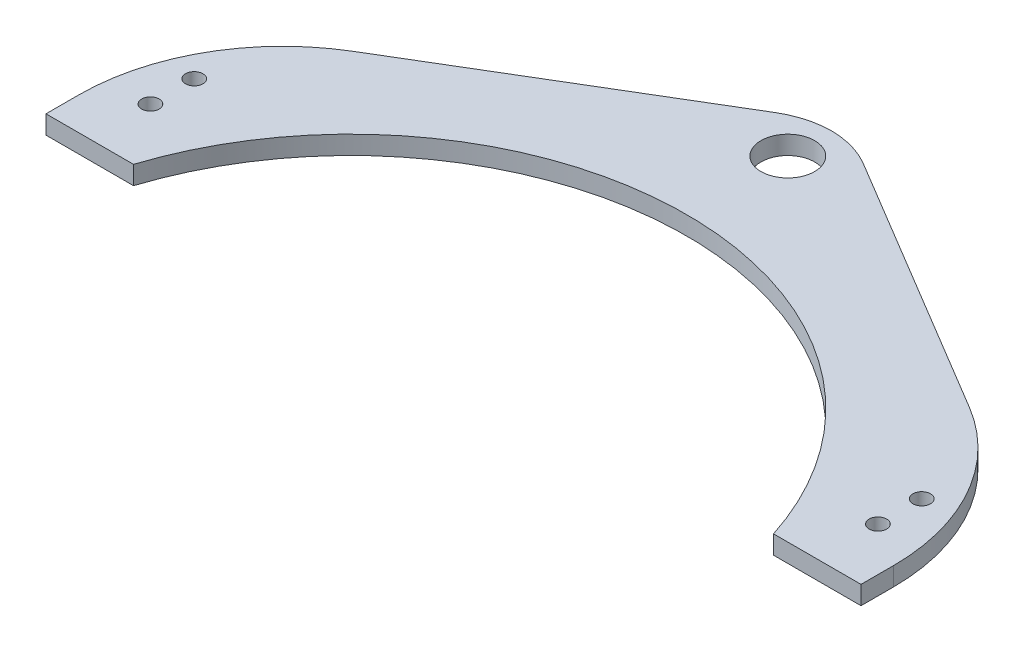
ISO-10303-21;
HEADER;
FILE_DESCRIPTION(('STEP AP214'),'2;1');
FILE_NAME('part.step','',(''),(''),'','','');
FILE_SCHEMA(('AUTOMOTIVE_DESIGN { 1 0 10303 214 1 1 1 1 }'));
ENDSEC;
DATA;
#1=APPLICATION_CONTEXT('core data for automotive mechanical design processes');
#2=APPLICATION_PROTOCOL_DEFINITION('international standard','automotive_design',2000,#1);
#3=PRODUCT_CONTEXT('',#1,'mechanical');
#4=PRODUCT('Part','Part','',(#3));
#5=PRODUCT_RELATED_PRODUCT_CATEGORY('part','',(#4));
#6=PRODUCT_DEFINITION_FORMATION('','',#4);
#7=PRODUCT_DEFINITION_CONTEXT('part definition',#1,'design');
#8=PRODUCT_DEFINITION('design','',#6,#7);
#9=PRODUCT_DEFINITION_SHAPE('','',#8);
#10=(LENGTH_UNIT() NAMED_UNIT(*) SI_UNIT(.MILLI.,.METRE.));
#11=(NAMED_UNIT(*) PLANE_ANGLE_UNIT() SI_UNIT($,.RADIAN.));
#12=(NAMED_UNIT(*) SI_UNIT($,.STERADIAN.) SOLID_ANGLE_UNIT());
#13=UNCERTAINTY_MEASURE_WITH_UNIT(LENGTH_MEASURE(1.E-05),#10,'distance_accuracy_value','');
#14=(GEOMETRIC_REPRESENTATION_CONTEXT(3) GLOBAL_UNCERTAINTY_ASSIGNED_CONTEXT((#13)) GLOBAL_UNIT_ASSIGNED_CONTEXT((#10,
#11,#12)) REPRESENTATION_CONTEXT('',''));
#15=CARTESIAN_POINT('',(0.,0.,0.));
#16=DIRECTION('',(0.,0.,1.));
#17=DIRECTION('',(1.,0.,0.));
#18=AXIS2_PLACEMENT_3D('',#15,#16,#17);
#19=CARTESIAN_POINT('',(0.,3.175,0.));
#20=DIRECTION('',(0.,0.,1.));
#21=DIRECTION('',(1.,0.,0.));
#22=AXIS2_PLACEMENT_3D('',#19,#20,#21);
#23=PLANE('',#22);
#24=DIRECTION('',(-1.,0.,0.));
#25=VECTOR('',#24,1.);
#26=CARTESIAN_POINT('',(0.,0.,0.));
#27=LINE('',#26,#25);
#28=CARTESIAN_POINT('',(0.,0.,0.));
#29=VERTEX_POINT('',#28);
#30=CARTESIAN_POINT('',(-15.,0.,0.));
#31=VERTEX_POINT('',#30);
#32=EDGE_CURVE('E180',#29,#31,#27,.T.);
#33=ORIENTED_EDGE('',*,*,#32,.F.);
#34=DIRECTION('',(0.,-1.,0.));
#35=VECTOR('',#34,1.);
#36=CARTESIAN_POINT('',(0.,3.175,0.));
#37=LINE('',#36,#35);
#38=CARTESIAN_POINT('',(0.,3.175,0.));
#39=VERTEX_POINT('',#38);
#40=EDGE_CURVE('E11',#39,#29,#37,.T.);
#41=ORIENTED_EDGE('',*,*,#40,.F.);
#42=DIRECTION('',(-1.,0.,0.));
#43=VECTOR('',#42,1.);
#44=CARTESIAN_POINT('',(0.,3.175,0.));
#45=LINE('',#44,#43);
#46=CARTESIAN_POINT('',(-15.,3.175,0.));
#47=VERTEX_POINT('',#46);
#48=EDGE_CURVE('E303',#39,#47,#45,.T.);
#49=ORIENTED_EDGE('',*,*,#48,.T.);
#50=DIRECTION('',(0.,-1.,0.));
#51=VECTOR('',#50,1.);
#52=CARTESIAN_POINT('',(-15.,3.175,0.));
#53=LINE('',#52,#51);
#54=EDGE_CURVE('E56',#47,#31,#53,.T.);
#55=ORIENTED_EDGE('',*,*,#54,.T.);
#56=EDGE_LOOP('',(#33,#41,#49,#55));
#57=FACE_BOUND('',#56,.T.);
#58=ADVANCED_FACE('F39',(#57),#23,.T.);
#59=CARTESIAN_POINT('',(54.850000028,3.175,17.6787730542931));
#60=DIRECTION('',(0.,-1.,0.));
#61=DIRECTION('',(0.,0.,-1.));
#62=AXIS2_PLACEMENT_3D('',#59,#60,#61);
#63=CYLINDRICAL_SURFACE('',#62,57.6286518997);
#64=CARTESIAN_POINT('',(54.850000028,0.,17.6787730542931));
#65=DIRECTION('',(0.,1.,0.));
#66=DIRECTION('',(0.,0.,1.));
#67=AXIS2_PLACEMENT_3D('',#64,#65,#66);
#68=CIRCLE('',#67,57.6286518997);
#69=CARTESIAN_POINT('',(109.700000056,0.,0.));
#70=VERTEX_POINT('',#69);
#71=EDGE_CURVE('E177',#29,#70,#68,.F.);
#72=ORIENTED_EDGE('',*,*,#71,.T.);
#73=DIRECTION('',(0.,-1.,0.));
#74=VECTOR('',#73,1.);
#75=CARTESIAN_POINT('',(109.700000056,3.175,0.));
#76=LINE('',#75,#74);
#77=CARTESIAN_POINT('',(109.700000056,3.175,0.));
#78=VERTEX_POINT('',#77);
#79=EDGE_CURVE('E48',#78,#70,#76,.T.);
#80=ORIENTED_EDGE('',*,*,#79,.F.);
#81=CARTESIAN_POINT('',(54.850000028,3.175,17.6787730542931));
#82=DIRECTION('',(0.,1.,0.));
#83=DIRECTION('',(0.,0.,1.));
#84=AXIS2_PLACEMENT_3D('',#81,#82,#83);
#85=CIRCLE('',#84,57.6286518997);
#86=EDGE_CURVE('E305',#39,#78,#85,.F.);
#87=ORIENTED_EDGE('',*,*,#86,.F.);
#88=ORIENTED_EDGE('',*,*,#40,.T.);
#89=EDGE_LOOP('',(#72,#80,#87,#88));
#90=FACE_BOUND('',#89,.T.);
#91=ADVANCED_FACE('F178',(#90),#63,.F.);
#92=CARTESIAN_POINT('',(0.,3.175,0.));
#93=DIRECTION('',(0.,0.,-1.));
#94=DIRECTION('',(-1.,0.,0.));
#95=AXIS2_PLACEMENT_3D('',#92,#93,#94);
#96=PLANE('',#95);
#97=DIRECTION('',(1.,0.,0.));
#98=VECTOR('',#97,1.);
#99=CARTESIAN_POINT('',(0.,0.,0.));
#100=LINE('',#99,#98);
#101=CARTESIAN_POINT('',(124.700000056,0.,0.));
#102=VERTEX_POINT('',#101);
#103=EDGE_CURVE('E171',#70,#102,#100,.T.);
#104=ORIENTED_EDGE('',*,*,#103,.T.);
#105=DIRECTION('',(0.,-1.,0.));
#106=VECTOR('',#105,1.);
#107=CARTESIAN_POINT('',(124.700000056,3.175,0.));
#108=LINE('',#107,#106);
#109=CARTESIAN_POINT('',(124.700000056,3.175,0.));
#110=VERTEX_POINT('',#109);
#111=EDGE_CURVE('E162',#110,#102,#108,.T.);
#112=ORIENTED_EDGE('',*,*,#111,.F.);
#113=DIRECTION('',(1.,0.,0.));
#114=VECTOR('',#113,1.);
#115=CARTESIAN_POINT('',(0.,3.175,0.));
#116=LINE('',#115,#114);
#117=EDGE_CURVE('E173',#78,#110,#116,.T.);
#118=ORIENTED_EDGE('',*,*,#117,.F.);
#119=ORIENTED_EDGE('',*,*,#79,.T.);
#120=EDGE_LOOP('',(#104,#112,#118,#119));
#121=FACE_BOUND('',#120,.T.);
#122=ADVANCED_FACE('F169',(#121),#96,.F.);
#123=CARTESIAN_POINT('',(124.700000056,3.175,0.));
#124=DIRECTION('',(-1.,0.,0.));
#125=DIRECTION('',(0.,0.,1.));
#126=AXIS2_PLACEMENT_3D('',#123,#124,#125);
#127=PLANE('',#126);
#128=DIRECTION('',(0.,0.,-1.));
#129=VECTOR('',#128,1.);
#130=CARTESIAN_POINT('',(124.700000056,0.,0.));
#131=LINE('',#130,#129);
#132=CARTESIAN_POINT('',(124.700000056,0.,-5.55492032584696));
#133=VERTEX_POINT('',#132);
#134=EDGE_CURVE('E182',#102,#133,#131,.T.);
#135=ORIENTED_EDGE('',*,*,#134,.T.);
#136=DIRECTION('',(0.,-1.,0.));
#137=VECTOR('',#136,1.);
#138=CARTESIAN_POINT('',(124.700000056,3.175,-5.55492032584696));
#139=LINE('',#138,#137);
#140=CARTESIAN_POINT('',(124.700000056,3.175,-5.55492032584696));
#141=VERTEX_POINT('',#140);
#142=EDGE_CURVE('E160',#141,#133,#139,.T.);
#143=ORIENTED_EDGE('',*,*,#142,.F.);
#144=DIRECTION('',(0.,0.,-1.));
#145=VECTOR('',#144,1.);
#146=CARTESIAN_POINT('',(124.700000056,3.175,0.));
#147=LINE('',#146,#145);
#148=EDGE_CURVE('E312',#110,#141,#147,.T.);
#149=ORIENTED_EDGE('',*,*,#148,.F.);
#150=ORIENTED_EDGE('',*,*,#111,.T.);
#151=EDGE_LOOP('',(#135,#143,#149,#150));
#152=FACE_BOUND('',#151,.T.);
#153=ADVANCED_FACE('F257',(#152),#127,.F.);
#154=CARTESIAN_POINT('',(89.700000056,3.175,-5.55492032584696));
#155=DIRECTION('',(0.,-1.,0.));
#156=DIRECTION('',(0.,0.,-1.));
#157=AXIS2_PLACEMENT_3D('',#154,#155,#156);
#158=CYLINDRICAL_SURFACE('',#157,35.);
#159=CARTESIAN_POINT('',(89.700000056,0.,-5.55492032584696));
#160=DIRECTION('',(0.,1.,0.));
#161=DIRECTION('',(0.,0.,1.));
#162=AXIS2_PLACEMENT_3D('',#159,#160,#161);
#163=CIRCLE('',#162,35.);
#164=CARTESIAN_POINT('',(107.670447225488,0.,-35.5892844531039));
#165=VERTEX_POINT('',#164);
#166=EDGE_CURVE('E190',#165,#133,#163,.F.);
#167=ORIENTED_EDGE('',*,*,#166,.F.);
#168=DIRECTION('',(0.,-1.,0.));
#169=VECTOR('',#168,1.);
#170=CARTESIAN_POINT('',(107.670447225488,3.175,-35.5892844531039));
#171=LINE('',#170,#169);
#172=CARTESIAN_POINT('',(107.670447225488,3.175,-35.5892844531039));
#173=VERTEX_POINT('',#172);
#174=EDGE_CURVE('E158',#173,#165,#171,.T.);
#175=ORIENTED_EDGE('',*,*,#174,.F.);
#176=CARTESIAN_POINT('',(89.700000056,3.175,-5.55492032584696));
#177=DIRECTION('',(0.,1.,0.));
#178=DIRECTION('',(0.,0.,1.));
#179=AXIS2_PLACEMENT_3D('',#176,#177,#178);
#180=CIRCLE('',#179,35.);
#181=EDGE_CURVE('E314',#173,#141,#180,.F.);
#182=ORIENTED_EDGE('',*,*,#181,.T.);
#183=ORIENTED_EDGE('',*,*,#142,.T.);
#184=EDGE_LOOP('',(#167,#175,#182,#183));
#185=FACE_BOUND('',#184,.T.);
#186=ADVANCED_FACE('F260',(#185),#158,.T.);
#187=CARTESIAN_POINT('',(44.064821704113,3.175,-73.6464088946613));
#188=DIRECTION('',(0.513441347699643,0.,-0.858124689350198));
#189=DIRECTION('',(-0.858124689350199,0.,-0.513441347699643));
#190=AXIS2_PLACEMENT_3D('',#187,#188,#189);
#191=PLANE('',#190);
#192=DIRECTION('',(0.858124689350199,0.,0.513441347699643));
#193=VECTOR('',#192,1.);
#194=CARTESIAN_POINT('',(44.064821704113,0.,-73.6464088946613));
#195=LINE('',#194,#193);
#196=CARTESIAN_POINT('',(62.4067852603332,0.,-62.671870340253));
#197=VERTEX_POINT('',#196);
#198=EDGE_CURVE('E193',#197,#165,#195,.T.);
#199=ORIENTED_EDGE('',*,*,#198,.F.);
#200=DIRECTION('',(0.,-1.,0.));
#201=VECTOR('',#200,1.);
#202=CARTESIAN_POINT('',(62.4067852603332,3.175,-62.671870340253));
#203=LINE('',#202,#201);
#204=CARTESIAN_POINT('',(62.4067852603332,3.175,-62.671870340253));
#205=VERTEX_POINT('',#204);
#206=EDGE_CURVE('E156',#205,#197,#203,.T.);
#207=ORIENTED_EDGE('',*,*,#206,.F.);
#208=DIRECTION('',(0.858124689350199,0.,0.513441347699643));
#209=VECTOR('',#208,1.);
#210=CARTESIAN_POINT('',(44.064821704113,3.175,-73.6464088946613));
#211=LINE('',#210,#209);
#212=EDGE_CURVE('E317',#205,#173,#211,.T.);
#213=ORIENTED_EDGE('',*,*,#212,.T.);
#214=ORIENTED_EDGE('',*,*,#174,.T.);
#215=EDGE_LOOP('',(#199,#207,#213,#214));
#216=FACE_BOUND('',#215,.T.);
#217=ADVANCED_FACE('F264',(#216),#191,.T.);
#218=CARTESIAN_POINT('',(54.7051650448386,3.175,-49.8));
#219=DIRECTION('',(0.,-1.,0.));
#220=DIRECTION('',(0.,0.,-1.));
#221=AXIS2_PLACEMENT_3D('',#218,#219,#220);
#222=CYLINDRICAL_SURFACE('',#221,15.);
#223=CARTESIAN_POINT('',(54.7051650448386,0.,-49.8));
#224=DIRECTION('',(0.,1.,0.));
#225=DIRECTION('',(0.,0.,1.));
#226=AXIS2_PLACEMENT_3D('',#223,#224,#225);
#227=CIRCLE('',#226,15.);
#228=CARTESIAN_POINT('',(54.850000028,0.,-64.7993007446232));
#229=VERTEX_POINT('',#228);
#230=EDGE_CURVE('E196',#229,#197,#227,.F.);
#231=ORIENTED_EDGE('',*,*,#230,.F.);
#232=DIRECTION('',(0.,-1.,0.));
#233=VECTOR('',#232,1.);
#234=CARTESIAN_POINT('',(54.850000028,3.175,-64.7993007446232));
#235=LINE('',#234,#233);
#236=CARTESIAN_POINT('',(54.850000028,3.175,-64.7993007446232));
#237=VERTEX_POINT('',#236);
#238=EDGE_CURVE('E150',#237,#229,#235,.T.);
#239=ORIENTED_EDGE('',*,*,#238,.F.);
#240=CARTESIAN_POINT('',(54.7051650448386,3.175,-49.8));
#241=DIRECTION('',(0.,1.,0.));
#242=DIRECTION('',(0.,0.,1.));
#243=AXIS2_PLACEMENT_3D('',#240,#241,#242);
#244=CIRCLE('',#243,15.);
#245=EDGE_CURVE('E320',#237,#205,#244,.F.);
#246=ORIENTED_EDGE('',*,*,#245,.T.);
#247=ORIENTED_EDGE('',*,*,#206,.T.);
#248=EDGE_LOOP('',(#231,#239,#246,#247));
#249=FACE_BOUND('',#248,.T.);
#250=ADVANCED_FACE('F268',(#249),#222,.T.);
#251=CARTESIAN_POINT('',(54.9948350111614,3.175,-49.8));
#252=DIRECTION('',(0.,-1.,0.));
#253=DIRECTION('',(0.,0.,-1.));
#254=AXIS2_PLACEMENT_3D('',#251,#252,#253);
#255=CYLINDRICAL_SURFACE('',#254,15.);
#256=CARTESIAN_POINT('',(54.9948350111614,0.,-49.8));
#257=DIRECTION('',(0.,1.,0.));
#258=DIRECTION('',(0.,0.,1.));
#259=AXIS2_PLACEMENT_3D('',#256,#257,#258);
#260=CIRCLE('',#259,15.);
#261=CARTESIAN_POINT('',(47.2932147956668,0.,-62.671870340253));
#262=VERTEX_POINT('',#261);
#263=EDGE_CURVE('E199',#229,#262,#260,.T.);
#264=ORIENTED_EDGE('',*,*,#263,.T.);
#265=DIRECTION('',(0.,-1.,0.));
#266=VECTOR('',#265,1.);
#267=CARTESIAN_POINT('',(47.2932147956668,3.175,-62.671870340253));
#268=LINE('',#267,#266);
#269=CARTESIAN_POINT('',(47.2932147956668,3.175,-62.671870340253));
#270=VERTEX_POINT('',#269);
#271=EDGE_CURVE('E148',#270,#262,#268,.T.);
#272=ORIENTED_EDGE('',*,*,#271,.F.);
#273=CARTESIAN_POINT('',(54.9948350111614,3.175,-49.8));
#274=DIRECTION('',(0.,1.,0.));
#275=DIRECTION('',(0.,0.,1.));
#276=AXIS2_PLACEMENT_3D('',#273,#274,#275);
#277=CIRCLE('',#276,15.);
#278=EDGE_CURVE('E141',#237,#270,#277,.T.);
#279=ORIENTED_EDGE('',*,*,#278,.F.);
#280=ORIENTED_EDGE('',*,*,#238,.T.);
#281=EDGE_LOOP('',(#264,#272,#279,#280));
#282=FACE_BOUND('',#281,.T.);
#283=ADVANCED_FACE('F272',(#282),#255,.T.);
#284=CARTESIAN_POINT('',(-15.1454863665697,3.175,-25.3129512097128));
#285=DIRECTION('',(0.513441347699643,0.,0.858124689350198));
#286=DIRECTION('',(0.858124689350199,0.,-0.513441347699643));
#287=AXIS2_PLACEMENT_3D('',#284,#285,#286);
#288=PLANE('',#287);
#289=DIRECTION('',(-0.858124689350198,0.,0.513441347699643));
#290=VECTOR('',#289,1.);
#291=CARTESIAN_POINT('',(-15.1454863665697,0.,-25.3129512097128));
#292=LINE('',#291,#290);
#293=CARTESIAN_POINT('',(2.02955283051251,0.,-35.5892844531039));
#294=VERTEX_POINT('',#293);
#295=EDGE_CURVE('E147',#262,#294,#292,.T.);
#296=ORIENTED_EDGE('',*,*,#295,.T.);
#297=DIRECTION('',(0.,-1.,0.));
#298=VECTOR('',#297,1.);
#299=CARTESIAN_POINT('',(2.02955283051251,3.175,-35.5892844531039));
#300=LINE('',#299,#298);
#301=CARTESIAN_POINT('',(2.02955283051251,3.175,-35.5892844531039));
#302=VERTEX_POINT('',#301);
#303=EDGE_CURVE('E128',#302,#294,#300,.T.);
#304=ORIENTED_EDGE('',*,*,#303,.F.);
#305=DIRECTION('',(-0.858124689350198,0.,0.513441347699643));
#306=VECTOR('',#305,1.);
#307=CARTESIAN_POINT('',(-15.1454863665697,3.175,-25.3129512097128));
#308=LINE('',#307,#306);
#309=EDGE_CURVE('E133',#270,#302,#308,.T.);
#310=ORIENTED_EDGE('',*,*,#309,.F.);
#311=ORIENTED_EDGE('',*,*,#271,.T.);
#312=EDGE_LOOP('',(#296,#304,#310,#311));
#313=FACE_BOUND('',#312,.T.);
#314=ADVANCED_FACE('F146',(#313),#288,.F.);
#315=CARTESIAN_POINT('',(20.,3.175,-5.55492032584694));
#316=DIRECTION('',(0.,-1.,0.));
#317=DIRECTION('',(0.,0.,-1.));
#318=AXIS2_PLACEMENT_3D('',#315,#316,#317);
#319=CYLINDRICAL_SURFACE('',#318,35.);
#320=CARTESIAN_POINT('',(20.,0.,-5.55492032584694));
#321=DIRECTION('',(0.,1.,0.));
#322=DIRECTION('',(0.,0.,1.));
#323=AXIS2_PLACEMENT_3D('',#320,#321,#322);
#324=CIRCLE('',#323,35.);
#325=CARTESIAN_POINT('',(-15.,0.,-5.55492032584694));
#326=VERTEX_POINT('',#325);
#327=EDGE_CURVE('E203',#294,#326,#324,.T.);
#328=ORIENTED_EDGE('',*,*,#327,.T.);
#329=DIRECTION('',(0.,-1.,0.));
#330=VECTOR('',#329,1.);
#331=CARTESIAN_POINT('',(-15.,3.175,-5.55492032584694));
#332=LINE('',#331,#330);
#333=CARTESIAN_POINT('',(-15.,3.175,-5.55492032584694));
#334=VERTEX_POINT('',#333);
#335=EDGE_CURVE('E91',#334,#326,#332,.T.);
#336=ORIENTED_EDGE('',*,*,#335,.F.);
#337=CARTESIAN_POINT('',(20.,3.175,-5.55492032584694));
#338=DIRECTION('',(0.,1.,0.));
#339=DIRECTION('',(0.,0.,1.));
#340=AXIS2_PLACEMENT_3D('',#337,#338,#339);
#341=CIRCLE('',#340,35.);
#342=EDGE_CURVE('E124',#302,#334,#341,.T.);
#343=ORIENTED_EDGE('',*,*,#342,.F.);
#344=ORIENTED_EDGE('',*,*,#303,.T.);
#345=EDGE_LOOP('',(#328,#336,#343,#344));
#346=FACE_BOUND('',#345,.T.);
#347=ADVANCED_FACE('F126',(#346),#319,.T.);
#348=CARTESIAN_POINT('',(117.200000056,3.175,-10.4));
#349=DIRECTION('',(0.,-1.,0.));
#350=DIRECTION('',(0.,0.,-1.));
#351=AXIS2_PLACEMENT_3D('',#348,#349,#350);
#352=CYLINDRICAL_SURFACE('',#351,1.5);
#353=CARTESIAN_POINT('',(117.200000056,3.175,-10.4));
#354=DIRECTION('',(0.,1.,0.));
#355=DIRECTION('',(0.,0.,1.));
#356=AXIS2_PLACEMENT_3D('',#353,#354,#355);
#357=CIRCLE('',#356,1.5);
#358=CARTESIAN_POINT('',(117.200000056,3.175,-8.9));
#359=VERTEX_POINT('',#358);
#360=EDGE_CURVE('E216',#359,#359,#357,.T.);
#361=ORIENTED_EDGE('',*,*,#360,.T.);
#362=EDGE_LOOP('',(#361));
#363=FACE_BOUND('',#362,.T.);
#364=CARTESIAN_POINT('',(117.200000056,0.,-10.4));
#365=DIRECTION('',(0.,1.,0.));
#366=DIRECTION('',(0.,0.,1.));
#367=AXIS2_PLACEMENT_3D('',#364,#365,#366);
#368=CIRCLE('',#367,1.5);
#369=CARTESIAN_POINT('',(117.200000056,0.,-8.9));
#370=VERTEX_POINT('',#369);
#371=EDGE_CURVE('E208',#370,#370,#368,.T.);
#372=ORIENTED_EDGE('',*,*,#371,.F.);
#373=EDGE_LOOP('',(#372));
#374=FACE_BOUND('',#373,.T.);
#375=ADVANCED_FACE('F245',(#363,#374),#352,.F.);
#376=CARTESIAN_POINT('',(-15.,3.175,0.));
#377=DIRECTION('',(-1.,0.,0.));
#378=DIRECTION('',(0.,0.,1.));
#379=AXIS2_PLACEMENT_3D('',#376,#377,#378);
#380=PLANE('',#379);
#381=DIRECTION('',(0.,0.,-1.));
#382=VECTOR('',#381,1.);
#383=CARTESIAN_POINT('',(-15.,0.,0.));
#384=LINE('',#383,#382);
#385=EDGE_CURVE('E205',#31,#326,#384,.T.);
#386=ORIENTED_EDGE('',*,*,#385,.F.);
#387=ORIENTED_EDGE('',*,*,#54,.F.);
#388=DIRECTION('',(0.,0.,-1.));
#389=VECTOR('',#388,1.);
#390=CARTESIAN_POINT('',(-15.,3.175,0.));
#391=LINE('',#390,#389);
#392=EDGE_CURVE('E132',#47,#334,#391,.T.);
#393=ORIENTED_EDGE('',*,*,#392,.T.);
#394=ORIENTED_EDGE('',*,*,#335,.T.);
#395=EDGE_LOOP('',(#386,#387,#393,#394));
#396=FACE_BOUND('',#395,.T.);
#397=ADVANCED_FACE('F237',(#396),#380,.T.);
#398=CARTESIAN_POINT('',(-7.5,3.175,-17.9));
#399=DIRECTION('',(0.,-1.,0.));
#400=DIRECTION('',(0.,0.,-1.));
#401=AXIS2_PLACEMENT_3D('',#398,#399,#400);
#402=CYLINDRICAL_SURFACE('',#401,1.5);
#403=CARTESIAN_POINT('',(-7.5,3.175,-17.9));
#404=DIRECTION('',(0.,1.,0.));
#405=DIRECTION('',(0.,0.,1.));
#406=AXIS2_PLACEMENT_3D('',#403,#404,#405);
#407=CIRCLE('',#406,1.5);
#408=CARTESIAN_POINT('',(-7.5,3.175,-16.4));
#409=VERTEX_POINT('',#408);
#410=EDGE_CURVE('E302',#409,#409,#407,.T.);
#411=ORIENTED_EDGE('',*,*,#410,.T.);
#412=EDGE_LOOP('',(#411));
#413=FACE_BOUND('',#412,.T.);
#414=CARTESIAN_POINT('',(-7.5,0.,-17.9));
#415=DIRECTION('',(0.,1.,0.));
#416=DIRECTION('',(0.,0.,1.));
#417=AXIS2_PLACEMENT_3D('',#414,#415,#416);
#418=CIRCLE('',#417,1.5);
#419=CARTESIAN_POINT('',(-7.5,0.,-16.4));
#420=VERTEX_POINT('',#419);
#421=EDGE_CURVE('E184',#420,#420,#418,.T.);
#422=ORIENTED_EDGE('',*,*,#421,.F.);
#423=EDGE_LOOP('',(#422));
#424=FACE_BOUND('',#423,.T.);
#425=ADVANCED_FACE('F234',(#413,#424),#402,.F.);
#426=CARTESIAN_POINT('',(-7.5,3.175,-10.4));
#427=DIRECTION('',(0.,-1.,0.));
#428=DIRECTION('',(0.,0.,-1.));
#429=AXIS2_PLACEMENT_3D('',#426,#427,#428);
#430=CYLINDRICAL_SURFACE('',#429,1.5);
#431=CARTESIAN_POINT('',(-7.5,3.175,-10.4));
#432=DIRECTION('',(0.,1.,0.));
#433=DIRECTION('',(0.,0.,1.));
#434=AXIS2_PLACEMENT_3D('',#431,#432,#433);
#435=CIRCLE('',#434,1.5);
#436=CARTESIAN_POINT('',(-7.5,3.175,-8.9));
#437=VERTEX_POINT('',#436);
#438=EDGE_CURVE('E300',#437,#437,#435,.T.);
#439=ORIENTED_EDGE('',*,*,#438,.T.);
#440=EDGE_LOOP('',(#439));
#441=FACE_BOUND('',#440,.T.);
#442=CARTESIAN_POINT('',(-7.5,0.,-10.4));
#443=DIRECTION('',(0.,1.,0.));
#444=DIRECTION('',(0.,0.,1.));
#445=AXIS2_PLACEMENT_3D('',#442,#443,#444);
#446=CIRCLE('',#445,1.5);
#447=CARTESIAN_POINT('',(-7.5,0.,-8.9));
#448=VERTEX_POINT('',#447);
#449=EDGE_CURVE('E227',#448,#448,#446,.T.);
#450=ORIENTED_EDGE('',*,*,#449,.F.);
#451=EDGE_LOOP('',(#450));
#452=FACE_BOUND('',#451,.T.);
#453=ADVANCED_FACE('F236',(#441,#452),#430,.F.);
#454=CARTESIAN_POINT('',(54.850000028,3.175,-57.3));
#455=DIRECTION('',(0.,-1.,0.));
#456=DIRECTION('',(0.,0.,-1.));
#457=AXIS2_PLACEMENT_3D('',#454,#455,#456);
#458=CYLINDRICAL_SURFACE('',#457,4.6);
#459=CARTESIAN_POINT('',(54.850000028,3.175,-57.3));
#460=DIRECTION('',(0.,1.,0.));
#461=DIRECTION('',(0.,0.,1.));
#462=AXIS2_PLACEMENT_3D('',#459,#460,#461);
#463=CIRCLE('',#462,4.6);
#464=CARTESIAN_POINT('',(54.850000028,3.175,-52.7));
#465=VERTEX_POINT('',#464);
#466=EDGE_CURVE('E213',#465,#465,#463,.T.);
#467=ORIENTED_EDGE('',*,*,#466,.T.);
#468=EDGE_LOOP('',(#467));
#469=FACE_BOUND('',#468,.T.);
#470=CARTESIAN_POINT('',(54.850000028,0.,-57.3));
#471=DIRECTION('',(0.,1.,0.));
#472=DIRECTION('',(0.,0.,1.));
#473=AXIS2_PLACEMENT_3D('',#470,#471,#472);
#474=CIRCLE('',#473,4.6);
#475=CARTESIAN_POINT('',(54.850000028,0.,-52.7));
#476=VERTEX_POINT('',#475);
#477=EDGE_CURVE('E224',#476,#476,#474,.T.);
#478=ORIENTED_EDGE('',*,*,#477,.F.);
#479=EDGE_LOOP('',(#478));
#480=FACE_BOUND('',#479,.T.);
#481=ADVANCED_FACE('F41',(#469,#480),#458,.F.);
#482=CARTESIAN_POINT('',(117.200000056,3.175,-17.9));
#483=DIRECTION('',(0.,-1.,0.));
#484=DIRECTION('',(0.,0.,-1.));
#485=AXIS2_PLACEMENT_3D('',#482,#483,#484);
#486=CYLINDRICAL_SURFACE('',#485,1.5);
#487=CARTESIAN_POINT('',(117.200000056,3.175,-17.9));
#488=DIRECTION('',(0.,1.,0.));
#489=DIRECTION('',(0.,0.,1.));
#490=AXIS2_PLACEMENT_3D('',#487,#488,#489);
#491=CIRCLE('',#490,1.5);
#492=CARTESIAN_POINT('',(117.200000056,3.175,-16.4));
#493=VERTEX_POINT('',#492);
#494=EDGE_CURVE('E214',#493,#493,#491,.T.);
#495=ORIENTED_EDGE('',*,*,#494,.T.);
#496=EDGE_LOOP('',(#495));
#497=FACE_BOUND('',#496,.T.);
#498=CARTESIAN_POINT('',(117.200000056,0.,-17.9));
#499=DIRECTION('',(0.,1.,0.));
#500=DIRECTION('',(0.,0.,1.));
#501=AXIS2_PLACEMENT_3D('',#498,#499,#500);
#502=CIRCLE('',#501,1.5);
#503=CARTESIAN_POINT('',(117.200000056,0.,-16.4));
#504=VERTEX_POINT('',#503);
#505=EDGE_CURVE('E211',#504,#504,#502,.T.);
#506=ORIENTED_EDGE('',*,*,#505,.F.);
#507=EDGE_LOOP('',(#506));
#508=FACE_BOUND('',#507,.T.);
#509=ADVANCED_FACE('F284',(#497,#508),#486,.F.);
#510=CARTESIAN_POINT('',(0.,3.175,0.));
#511=DIRECTION('',(0.,1.,0.));
#512=DIRECTION('',(0.,0.,1.));
#513=AXIS2_PLACEMENT_3D('',#510,#511,#512);
#514=PLANE('',#513);
#515=ORIENTED_EDGE('',*,*,#466,.F.);
#516=EDGE_LOOP('',(#515));
#517=FACE_BOUND('',#516,.T.);
#518=ORIENTED_EDGE('',*,*,#438,.F.);
#519=EDGE_LOOP('',(#518));
#520=FACE_BOUND('',#519,.T.);
#521=ORIENTED_EDGE('',*,*,#410,.F.);
#522=EDGE_LOOP('',(#521));
#523=FACE_BOUND('',#522,.T.);
#524=ORIENTED_EDGE('',*,*,#48,.F.);
#525=ORIENTED_EDGE('',*,*,#86,.T.);
#526=ORIENTED_EDGE('',*,*,#117,.T.);
#527=ORIENTED_EDGE('',*,*,#148,.T.);
#528=ORIENTED_EDGE('',*,*,#181,.F.);
#529=ORIENTED_EDGE('',*,*,#212,.F.);
#530=ORIENTED_EDGE('',*,*,#245,.F.);
#531=ORIENTED_EDGE('',*,*,#278,.T.);
#532=ORIENTED_EDGE('',*,*,#309,.T.);
#533=ORIENTED_EDGE('',*,*,#342,.T.);
#534=ORIENTED_EDGE('',*,*,#392,.F.);
#535=EDGE_LOOP('',(#524,#525,#526,#527,#528,#529,#530,#531,#532,#533,#534));
#536=FACE_BOUND('',#535,.T.);
#537=ORIENTED_EDGE('',*,*,#360,.F.);
#538=EDGE_LOOP('',(#537));
#539=FACE_BOUND('',#538,.T.);
#540=ORIENTED_EDGE('',*,*,#494,.F.);
#541=EDGE_LOOP('',(#540));
#542=FACE_BOUND('',#541,.T.);
#543=ADVANCED_FACE('F137',(#517,#520,#523,#536,#539,#542),#514,.T.);
#544=CARTESIAN_POINT('',(0.,0.,0.));
#545=DIRECTION('',(0.,1.,0.));
#546=DIRECTION('',(0.,0.,1.));
#547=AXIS2_PLACEMENT_3D('',#544,#545,#546);
#548=PLANE('',#547);
#549=ORIENTED_EDGE('',*,*,#477,.T.);
#550=EDGE_LOOP('',(#549));
#551=FACE_BOUND('',#550,.T.);
#552=ORIENTED_EDGE('',*,*,#449,.T.);
#553=EDGE_LOOP('',(#552));
#554=FACE_BOUND('',#553,.T.);
#555=ORIENTED_EDGE('',*,*,#421,.T.);
#556=EDGE_LOOP('',(#555));
#557=FACE_BOUND('',#556,.T.);
#558=ORIENTED_EDGE('',*,*,#32,.T.);
#559=ORIENTED_EDGE('',*,*,#385,.T.);
#560=ORIENTED_EDGE('',*,*,#327,.F.);
#561=ORIENTED_EDGE('',*,*,#295,.F.);
#562=ORIENTED_EDGE('',*,*,#263,.F.);
#563=ORIENTED_EDGE('',*,*,#230,.T.);
#564=ORIENTED_EDGE('',*,*,#198,.T.);
#565=ORIENTED_EDGE('',*,*,#166,.T.);
#566=ORIENTED_EDGE('',*,*,#134,.F.);
#567=ORIENTED_EDGE('',*,*,#103,.F.);
#568=ORIENTED_EDGE('',*,*,#71,.F.);
#569=EDGE_LOOP('',(#558,#559,#560,#561,#562,#563,#564,#565,#566,#567,#568));
#570=FACE_BOUND('',#569,.T.);
#571=ORIENTED_EDGE('',*,*,#371,.T.);
#572=EDGE_LOOP('',(#571));
#573=FACE_BOUND('',#572,.T.);
#574=ORIENTED_EDGE('',*,*,#505,.T.);
#575=EDGE_LOOP('',(#574));
#576=FACE_BOUND('',#575,.T.);
#577=ADVANCED_FACE('F232',(#551,#554,#557,#570,#573,#576),#548,.F.);
#578=CLOSED_SHELL('',(#58,#91,#122,#153,#186,#217,#250,#283,#314,#347,#375,#397,#425,#453,#481,
#509,#543,#577));
#579=MANIFOLD_SOLID_BREP('B2',#578);
#580=ADVANCED_BREP_SHAPE_REPRESENTATION('',(#18,#579),#14);
#581=SHAPE_DEFINITION_REPRESENTATION(#9,#580);
ENDSEC;
END-ISO-10303-21;
